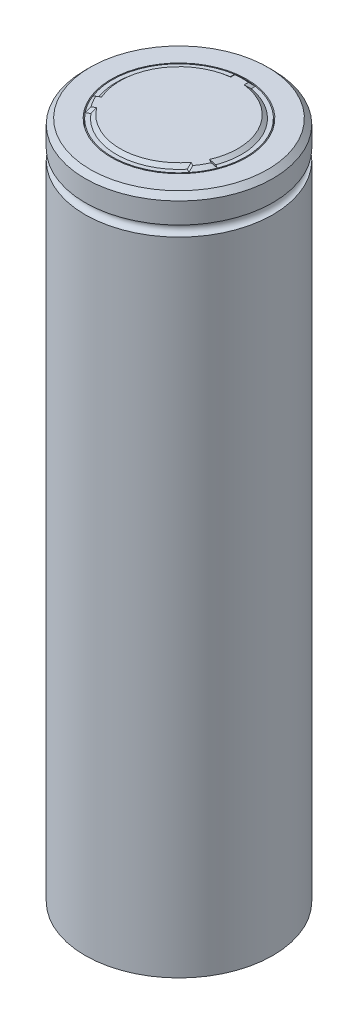
ISO-10303-21;
HEADER;
FILE_DESCRIPTION(('STEP AP214'),'2;1');
FILE_NAME('part.step','',(''),(''),'','','');
FILE_SCHEMA(('AUTOMOTIVE_DESIGN { 1 0 10303 214 1 1 1 1 }'));
ENDSEC;
DATA;
#1=APPLICATION_CONTEXT('core data for automotive mechanical design processes');
#2=APPLICATION_PROTOCOL_DEFINITION('international standard','automotive_design',2000,#1);
#3=PRODUCT_CONTEXT('',#1,'mechanical');
#4=PRODUCT('Part','Part','',(#3));
#5=PRODUCT_RELATED_PRODUCT_CATEGORY('part','',(#4));
#6=PRODUCT_DEFINITION_FORMATION('','',#4);
#7=PRODUCT_DEFINITION_CONTEXT('part definition',#1,'design');
#8=PRODUCT_DEFINITION('design','',#6,#7);
#9=PRODUCT_DEFINITION_SHAPE('','',#8);
#10=(LENGTH_UNIT() NAMED_UNIT(*) SI_UNIT(.MILLI.,.METRE.));
#11=(NAMED_UNIT(*) PLANE_ANGLE_UNIT() SI_UNIT($,.RADIAN.));
#12=(NAMED_UNIT(*) SI_UNIT($,.STERADIAN.) SOLID_ANGLE_UNIT());
#13=UNCERTAINTY_MEASURE_WITH_UNIT(LENGTH_MEASURE(1.E-05),#10,'distance_accuracy_value','');
#14=(GEOMETRIC_REPRESENTATION_CONTEXT(3) GLOBAL_UNCERTAINTY_ASSIGNED_CONTEXT((#13)) GLOBAL_UNIT_ASSIGNED_CONTEXT((#10,
#11,#12)) REPRESENTATION_CONTEXT('',''));
#15=CARTESIAN_POINT('',(0.,0.,0.));
#16=DIRECTION('',(0.,0.,1.));
#17=DIRECTION('',(1.,0.,0.));
#18=AXIS2_PLACEMENT_3D('',#15,#16,#17);
#19=CARTESIAN_POINT('',(0.,65.,0.));
#20=DIRECTION('',(0.,-1.,0.));
#21=DIRECTION('',(0.,0.,-1.));
#22=AXIS2_PLACEMENT_3D('',#19,#20,#21);
#23=CYLINDRICAL_SURFACE('',#22,9.);
#24=CARTESIAN_POINT('',(0.,0.,0.));
#25=DIRECTION('',(0.,1.,0.));
#26=DIRECTION('',(0.,0.,1.));
#27=AXIS2_PLACEMENT_3D('',#24,#25,#26);
#28=CIRCLE('',#27,9.);
#29=CARTESIAN_POINT('',(0.,0.,9.));
#30=VERTEX_POINT('',#29);
#31=EDGE_CURVE('E61',#30,#30,#28,.T.);
#32=ORIENTED_EDGE('',*,*,#31,.T.);
#33=EDGE_LOOP('',(#32));
#34=FACE_BOUND('',#33,.T.);
#35=CARTESIAN_POINT('',(0.,61.5,0.));
#36=DIRECTION('',(0.,1.,0.));
#37=DIRECTION('',(0.,0.,1.));
#38=AXIS2_PLACEMENT_3D('',#35,#36,#37);
#39=CIRCLE('',#38,9.);
#40=CARTESIAN_POINT('',(0.,61.5,9.));
#41=VERTEX_POINT('',#40);
#42=EDGE_CURVE('E67',#41,#41,#39,.T.);
#43=ORIENTED_EDGE('',*,*,#42,.F.);
#44=EDGE_LOOP('',(#43));
#45=FACE_BOUND('',#44,.T.);
#46=ADVANCED_FACE('F46',(#34,#45),#23,.T.);
#47=CARTESIAN_POINT('',(0.,0.,0.));
#48=DIRECTION('',(0.,1.,0.));
#49=DIRECTION('',(0.,0.,1.));
#50=AXIS2_PLACEMENT_3D('',#47,#48,#49);
#51=PLANE('',#50);
#52=CARTESIAN_POINT('',(0.,0.,0.));
#53=DIRECTION('',(0.,-1.,0.));
#54=DIRECTION('',(0.,0.,-1.));
#55=AXIS2_PLACEMENT_3D('',#52,#53,#54);
#56=CIRCLE('',#55,6.5);
#57=CARTESIAN_POINT('',(0.,0.,-6.5));
#58=VERTEX_POINT('',#57);
#59=EDGE_CURVE('E11',#58,#58,#56,.T.);
#60=ORIENTED_EDGE('',*,*,#59,.F.);
#61=EDGE_LOOP('',(#60));
#62=FACE_BOUND('',#61,.T.);
#63=ORIENTED_EDGE('',*,*,#31,.F.);
#64=EDGE_LOOP('',(#63));
#65=FACE_BOUND('',#64,.T.);
#66=ADVANCED_FACE('F48',(#62,#65),#51,.F.);
#67=CARTESIAN_POINT('',(0.,62.,0.));
#68=DIRECTION('',(0.,-1.,0.));
#69=DIRECTION('',(0.,0.,-1.));
#70=AXIS2_PLACEMENT_3D('',#67,#68,#69);
#71=TOROIDAL_SURFACE('',#70,9.,0.500000000000001);
#72=CARTESIAN_POINT('',(0.,62.5,0.));
#73=DIRECTION('',(0.,-1.,0.));
#74=DIRECTION('',(0.,0.,-1.));
#75=AXIS2_PLACEMENT_3D('',#72,#73,#74);
#76=CIRCLE('',#75,9.);
#77=CARTESIAN_POINT('',(0.,62.5,-9.));
#78=VERTEX_POINT('',#77);
#79=EDGE_CURVE('E64',#78,#78,#76,.T.);
#80=ORIENTED_EDGE('',*,*,#79,.T.);
#81=EDGE_LOOP('',(#80));
#82=FACE_BOUND('',#81,.T.);
#83=ORIENTED_EDGE('',*,*,#42,.T.);
#84=EDGE_LOOP('',(#83));
#85=FACE_BOUND('',#84,.T.);
#86=ADVANCED_FACE('F95',(#82,#85),#71,.F.);
#87=CARTESIAN_POINT('',(0.,65.,0.));
#88=DIRECTION('',(0.,1.,0.));
#89=DIRECTION('',(0.,0.,1.));
#90=AXIS2_PLACEMENT_3D('',#87,#88,#89);
#91=PLANE('',#90);
#92=CARTESIAN_POINT('',(0.,65.,0.));
#93=DIRECTION('',(0.,-1.,0.));
#94=DIRECTION('',(0.,0.,-1.));
#95=AXIS2_PLACEMENT_3D('',#92,#93,#94);
#96=CIRCLE('',#95,6.5);
#97=CARTESIAN_POINT('',(0.,65.,-6.5));
#98=VERTEX_POINT('',#97);
#99=EDGE_CURVE('E50',#98,#98,#96,.T.);
#100=ORIENTED_EDGE('',*,*,#99,.T.);
#101=EDGE_LOOP('',(#100));
#102=FACE_BOUND('',#101,.T.);
#103=CARTESIAN_POINT('',(0.,65.,0.));
#104=DIRECTION('',(0.,1.,0.));
#105=DIRECTION('',(0.,0.,1.));
#106=AXIS2_PLACEMENT_3D('',#103,#104,#105);
#107=CIRCLE('',#106,8.5);
#108=CARTESIAN_POINT('',(0.,65.,8.5));
#109=VERTEX_POINT('',#108);
#110=EDGE_CURVE('E58',#109,#109,#107,.T.);
#111=ORIENTED_EDGE('',*,*,#110,.T.);
#112=EDGE_LOOP('',(#111));
#113=FACE_BOUND('',#112,.T.);
#114=ADVANCED_FACE('F76',(#102,#113),#91,.T.);
#115=CARTESIAN_POINT('',(0.,64.5,0.));
#116=DIRECTION('',(0.,1.,0.));
#117=DIRECTION('',(0.,0.,1.));
#118=AXIS2_PLACEMENT_3D('',#115,#116,#117);
#119=CIRCLE('',#118,9.);
#120=CARTESIAN_POINT('',(0.,64.5,9.));
#121=VERTEX_POINT('',#120);
#122=EDGE_CURVE('E54',#121,#121,#119,.F.);
#123=ORIENTED_EDGE('',*,*,#122,.T.);
#124=EDGE_LOOP('',(#123));
#125=FACE_BOUND('',#124,.T.);
#126=ORIENTED_EDGE('',*,*,#79,.F.);
#127=EDGE_LOOP('',(#126));
#128=FACE_BOUND('',#127,.T.);
#129=ADVANCED_FACE('F85',(#125,#128),#23,.T.);
#130=CARTESIAN_POINT('',(0.,65.,0.));
#131=DIRECTION('',(0.,-1.,0.));
#132=DIRECTION('',(0.,0.,-1.));
#133=AXIS2_PLACEMENT_3D('',#130,#131,#132);
#134=CONICAL_SURFACE('',#133,8.5,0.785398163397447);
#135=ORIENTED_EDGE('',*,*,#122,.F.);
#136=EDGE_LOOP('',(#135));
#137=FACE_BOUND('',#136,.T.);
#138=ORIENTED_EDGE('',*,*,#110,.F.);
#139=EDGE_LOOP('',(#138));
#140=FACE_BOUND('',#139,.T.);
#141=ADVANCED_FACE('F80',(#137,#140),#134,.T.);
#142=CARTESIAN_POINT('',(0.,65.,0.));
#143=DIRECTION('',(0.,-1.,0.));
#144=DIRECTION('',(0.,0.,-1.));
#145=AXIS2_PLACEMENT_3D('',#142,#143,#144);
#146=CYLINDRICAL_SURFACE('',#145,6.5);
#147=ORIENTED_EDGE('',*,*,#99,.F.);
#148=EDGE_LOOP('',(#147));
#149=FACE_BOUND('',#148,.T.);
#150=ORIENTED_EDGE('',*,*,#59,.T.);
#151=EDGE_LOOP('',(#150));
#152=FACE_BOUND('',#151,.T.);
#153=ADVANCED_FACE('F78',(#149,#152),#146,.F.);
#154=CLOSED_SHELL('',(#46,#66,#86,#114,#129,#141,#153));
#155=MANIFOLD_SOLID_BREP('B2',#154);
#156=CARTESIAN_POINT('',(0.,65.,0.));
#157=DIRECTION('',(0.,1.,0.));
#158=DIRECTION('',(0.,0.,1.));
#159=AXIS2_PLACEMENT_3D('',#156,#157,#158);
#160=PLANE('',#159);
#161=DIRECTION('',(0.,0.,-1.));
#162=VECTOR('',#161,1.);
#163=CARTESIAN_POINT('',(1.,65.,-5.91607978309962));
#164=LINE('',#163,#162);
#165=CARTESIAN_POINT('',(1.,65.,-5.91607978309962));
#166=VERTEX_POINT('',#165);
#167=CARTESIAN_POINT('',(1.,65.,-6.32139225171164));
#168=VERTEX_POINT('',#167);
#169=EDGE_CURVE('E194',#166,#168,#164,.T.);
#170=ORIENTED_EDGE('',*,*,#169,.F.);
#171=CARTESIAN_POINT('',(0.,65.,0.));
#172=DIRECTION('',(0.,1.,0.));
#173=DIRECTION('',(0.,0.,1.));
#174=AXIS2_PLACEMENT_3D('',#171,#172,#173);
#175=CIRCLE('',#174,6.);
#176=CARTESIAN_POINT('',(5.62347538297981,65.,2.09201448776534));
#177=VERTEX_POINT('',#176);
#178=EDGE_CURVE('E198',#177,#166,#175,.T.);
#179=ORIENTED_EDGE('',*,*,#178,.F.);
#180=DIRECTION('',(-0.866025403784384,0.,-0.500000000000096));
#181=VECTOR('',#180,1.);
#182=CARTESIAN_POINT('',(5.62347538297981,65.,2.09201448776534));
#183=LINE('',#182,#181);
#184=CARTESIAN_POINT('',(5.97448627726839,65.,2.2946707220714));
#185=VERTEX_POINT('',#184);
#186=EDGE_CURVE('E477',#185,#177,#183,.T.);
#187=ORIENTED_EDGE('',*,*,#186,.F.);
#188=CARTESIAN_POINT('',(0.,65.,0.));
#189=DIRECTION('',(0.,-1.,0.));
#190=DIRECTION('',(0.,0.,-1.));
#191=AXIS2_PLACEMENT_3D('',#188,#189,#190);
#192=CIRCLE('',#191,6.4);
#193=EDGE_CURVE('E44',#168,#185,#192,.T.);
#194=ORIENTED_EDGE('',*,*,#193,.F.);
#195=EDGE_LOOP('',(#170,#179,#187,#194));
#196=FACE_BOUND('',#195,.T.);
#197=ADVANCED_FACE('F177',(#196),#160,.T.);
#198=DIRECTION('',(0.866025403784384,0.,0.500000000000096));
#199=VECTOR('',#198,1.);
#200=CARTESIAN_POINT('',(4.62347538297897,65.,3.82406529533525));
#201=LINE('',#200,#199);
#202=CARTESIAN_POINT('',(4.62347538297897,65.,3.82406529533525));
#203=VERTEX_POINT('',#202);
#204=CARTESIAN_POINT('',(4.97448627726755,65.,4.02672152964131));
#205=VERTEX_POINT('',#204);
#206=EDGE_CURVE('E471',#203,#205,#201,.T.);
#207=ORIENTED_EDGE('',*,*,#206,.F.);
#208=CARTESIAN_POINT('',(0.,65.,0.));
#209=DIRECTION('',(0.,1.,0.));
#210=DIRECTION('',(0.,0.,1.));
#211=AXIS2_PLACEMENT_3D('',#208,#209,#210);
#212=CIRCLE('',#211,6.);
#213=CARTESIAN_POINT('',(-4.62347538298061,65.,3.82406529533326));
#214=VERTEX_POINT('',#213);
#215=EDGE_CURVE('E468',#214,#203,#212,.T.);
#216=ORIENTED_EDGE('',*,*,#215,.F.);
#217=DIRECTION('',(0.866025403784489,0.,-0.499999999999912));
#218=VECTOR('',#217,1.);
#219=CARTESIAN_POINT('',(-4.62347538298061,65.,3.82406529533327));
#220=LINE('',#219,#218);
#221=CARTESIAN_POINT('',(-4.97448627726922,65.,4.02672152963924));
#222=VERTEX_POINT('',#221);
#223=EDGE_CURVE('E278',#222,#214,#220,.T.);
#224=ORIENTED_EDGE('',*,*,#223,.F.);
#225=EDGE_CURVE('E186',#205,#222,#192,.T.);
#226=ORIENTED_EDGE('',*,*,#225,.F.);
#227=EDGE_LOOP('',(#207,#216,#224,#226));
#228=FACE_BOUND('',#227,.T.);
#229=ADVANCED_FACE('F442',(#228),#160,.T.);
#230=DIRECTION('',(0.,0.,1.));
#231=VECTOR('',#230,1.);
#232=CARTESIAN_POINT('',(-1.,65.,-5.91607978309962));
#233=LINE('',#232,#231);
#234=CARTESIAN_POINT('',(-1.,65.,-6.32139225171164));
#235=VERTEX_POINT('',#234);
#236=CARTESIAN_POINT('',(-1.,65.,-5.91607978309962));
#237=VERTEX_POINT('',#236);
#238=EDGE_CURVE('E286',#235,#237,#233,.T.);
#239=ORIENTED_EDGE('',*,*,#238,.F.);
#240=CARTESIAN_POINT('',(-5.97448627726842,65.,2.29467072207132));
#241=VERTEX_POINT('',#240);
#242=EDGE_CURVE('E187',#241,#235,#192,.T.);
#243=ORIENTED_EDGE('',*,*,#242,.F.);
#244=DIRECTION('',(-0.866025403784489,0.,0.499999999999913));
#245=VECTOR('',#244,1.);
#246=CARTESIAN_POINT('',(-5.62347538297981,65.,2.09201448776534));
#247=LINE('',#246,#245);
#248=CARTESIAN_POINT('',(-5.62347538297981,65.,2.09201448776534));
#249=VERTEX_POINT('',#248);
#250=EDGE_CURVE('E279',#249,#241,#247,.T.);
#251=ORIENTED_EDGE('',*,*,#250,.F.);
#252=CARTESIAN_POINT('',(0.,65.,0.));
#253=DIRECTION('',(0.,1.,0.));
#254=DIRECTION('',(0.,0.,1.));
#255=AXIS2_PLACEMENT_3D('',#252,#253,#254);
#256=CIRCLE('',#255,6.);
#257=EDGE_CURVE('E295',#237,#249,#256,.T.);
#258=ORIENTED_EDGE('',*,*,#257,.F.);
#259=EDGE_LOOP('',(#239,#243,#251,#258));
#260=FACE_BOUND('',#259,.T.);
#261=ADVANCED_FACE('F283',(#260),#160,.T.);
#262=CARTESIAN_POINT('',(0.,65.,0.));
#263=DIRECTION('',(0.,-1.,0.));
#264=DIRECTION('',(0.,0.,-1.));
#265=AXIS2_PLACEMENT_3D('',#262,#263,#264);
#266=CYLINDRICAL_SURFACE('',#265,6.4);
#267=ORIENTED_EDGE('',*,*,#193,.T.);
#268=CARTESIAN_POINT('',(0.,65.,0.));
#269=DIRECTION('',(0.,1.,0.));
#270=DIRECTION('',(0.,0.,1.));
#271=AXIS2_PLACEMENT_3D('',#268,#269,#270);
#272=CIRCLE('',#271,6.4);
#273=EDGE_CURVE('E474',#205,#185,#272,.T.);
#274=ORIENTED_EDGE('',*,*,#273,.F.);
#275=ORIENTED_EDGE('',*,*,#225,.T.);
#276=CARTESIAN_POINT('',(0.,65.,0.));
#277=DIRECTION('',(0.,1.,0.));
#278=DIRECTION('',(0.,0.,1.));
#279=AXIS2_PLACEMENT_3D('',#276,#277,#278);
#280=CIRCLE('',#279,6.4);
#281=EDGE_CURVE('E268',#241,#222,#280,.T.);
#282=ORIENTED_EDGE('',*,*,#281,.F.);
#283=ORIENTED_EDGE('',*,*,#242,.T.);
#284=CARTESIAN_POINT('',(0.,65.,0.));
#285=DIRECTION('',(0.,1.,0.));
#286=DIRECTION('',(0.,0.,1.));
#287=AXIS2_PLACEMENT_3D('',#284,#285,#286);
#288=CIRCLE('',#287,6.4);
#289=EDGE_CURVE('E480',#168,#235,#288,.T.);
#290=ORIENTED_EDGE('',*,*,#289,.F.);
#291=EDGE_LOOP('',(#267,#274,#275,#282,#283,#290));
#292=FACE_BOUND('',#291,.T.);
#293=CARTESIAN_POINT('',(0.,0.,0.));
#294=DIRECTION('',(0.,-1.,0.));
#295=DIRECTION('',(0.,0.,-1.));
#296=AXIS2_PLACEMENT_3D('',#293,#294,#295);
#297=CIRCLE('',#296,6.4);
#298=CARTESIAN_POINT('',(0.,0.,-6.4));
#299=VERTEX_POINT('',#298);
#300=EDGE_CURVE('E181',#299,#299,#297,.T.);
#301=ORIENTED_EDGE('',*,*,#300,.F.);
#302=EDGE_LOOP('',(#301));
#303=FACE_BOUND('',#302,.T.);
#304=ADVANCED_FACE('F270',(#292,#303),#266,.T.);
#305=CARTESIAN_POINT('',(0.,0.,0.));
#306=DIRECTION('',(0.,1.,0.));
#307=DIRECTION('',(0.,0.,1.));
#308=AXIS2_PLACEMENT_3D('',#305,#306,#307);
#309=PLANE('',#308);
#310=ORIENTED_EDGE('',*,*,#300,.T.);
#311=EDGE_LOOP('',(#310));
#312=FACE_BOUND('',#311,.T.);
#313=ADVANCED_FACE('F179',(#312),#309,.F.);
#314=CARTESIAN_POINT('',(0.,65.,0.));
#315=DIRECTION('',(0.,-1.,0.));
#316=DIRECTION('',(0.,0.,1.));
#317=AXIS2_PLACEMENT_3D('',#314,#315,#316);
#318=CONICAL_SURFACE('',#317,6.,0.872664625997166);
#319=ORIENTED_EDGE('',*,*,#257,.T.);
#320=CARTESIAN_POINT('',(-5.17598251743646,65.3,2.24648991587866));
#321=CARTESIAN_POINT('',(-5.2511552021513,65.250412684668,2.2216528628978));
#322=CARTESIAN_POINT('',(-5.32603266043714,65.2006189971599,2.19636136828614));
#323=CARTESIAN_POINT('',(-5.47519694755351,65.1006189961826,2.14486955676297));
#324=CARTESIAN_POINT('',(-5.54948377778212,65.0504126836907,2.11866924200353));
#325=CARTESIAN_POINT('',(-5.62347538297982,65.,2.09201448776537));
#326=B_SPLINE_CURVE_WITH_KNOTS('',3,(#320,#321,#322,#323,#324,#325),.UNSPECIFIED.,.F.,.F.,(4,2,
4),(0.,0.280234442872825,0.560468222200871),.UNSPECIFIED.);
#327=CARTESIAN_POINT('',(-5.17598251743646,65.3,2.24648991587866));
#328=VERTEX_POINT('',#327);
#329=EDGE_CURVE('E293',#328,#249,#326,.T.);
#330=ORIENTED_EDGE('',*,*,#329,.F.);
#331=CARTESIAN_POINT('',(0.,65.3,0.));
#332=DIRECTION('',(0.,1.,0.));
#333=DIRECTION('',(0.,0.,1.));
#334=AXIS2_PLACEMENT_3D('',#331,#332,#333);
#335=CIRCLE('',#334,5.64247392222174);
#336=CARTESIAN_POINT('',(-0.642473922221742,65.3,-5.60577730758344));
#337=VERTEX_POINT('',#336);
#338=EDGE_CURVE('E317',#337,#328,#335,.T.);
#339=ORIENTED_EDGE('',*,*,#338,.F.);
#340=CARTESIAN_POINT('',(-0.642473922221742,65.3,-5.60577730758344));
#341=CARTESIAN_POINT('',(-0.701569783415724,65.250412684668,-5.65846023572674));
#342=CARTESIAN_POINT('',(-0.760911589392015,65.2006189971599,-5.71066026946726));
#343=CARTESIAN_POINT('',(-0.880086949816133,65.1006189961826,-5.81409442568584));
#344=CARTESIAN_POINT('',(-0.939920503099257,65.0504126836907,-5.86532855045073));
#345=CARTESIAN_POINT('',(-0.999999999999985,65.,-5.91607978309964));
#346=B_SPLINE_CURVE_WITH_KNOTS('',3,(#340,#341,#342,#343,#344,#345),.UNSPECIFIED.,.F.,.F.,(4,2,
4),(0.,0.280234442872816,0.560468222200854),.UNSPECIFIED.);
#347=EDGE_CURVE('E339',#337,#237,#346,.T.);
#348=ORIENTED_EDGE('',*,*,#347,.T.);
#349=EDGE_LOOP('',(#319,#330,#339,#348));
#350=FACE_BOUND('',#349,.T.);
#351=ADVANCED_FACE('F325',(#350),#318,.T.);
#352=CARTESIAN_POINT('',(-5.62347538297981,65.,2.09201448776534));
#353=DIRECTION('',(-0.321393804843213,0.766044443118979,-0.556670399226451));
#354=DIRECTION('',(0.,0.587858883152577,0.808963493303997));
#355=AXIS2_PLACEMENT_3D('',#352,#353,#354);
#356=PLANE('',#355);
#357=ORIENTED_EDGE('',*,*,#250,.T.);
#358=CARTESIAN_POINT('',(-5.52450889038732,65.3,2.44771171112148));
#359=CARTESIAN_POINT('',(-5.60006188679367,65.2503942101823,2.42306880811629));
#360=CARTESIAN_POINT('',(-5.67533653750406,65.20059129027,2.39799392777544));
#361=CARTESIAN_POINT('',(-5.82532899869294,65.1005912894875,2.34698026304409));
#362=CARTESIAN_POINT('',(-5.90004681027625,65.0503942093999,2.32104148036823));
#363=CARTESIAN_POINT('',(-5.97448627726843,65.,2.29467072207133));
#364=B_SPLINE_CURVE_WITH_KNOTS('',3,(#358,#359,#360,#361,#362,#363),.UNSPECIFIED.,.F.,.F.,(4,2,
4),(0.,0.281030570328719,0.562060582915392),.UNSPECIFIED.);
#365=CARTESIAN_POINT('',(-5.52450889038732,65.3,2.44771171112148));
#366=VERTEX_POINT('',#365);
#367=EDGE_CURVE('E290',#366,#241,#364,.T.);
#368=ORIENTED_EDGE('',*,*,#367,.F.);
#369=DIRECTION('',(0.866025403784489,0.,-0.499999999999913));
#370=VECTOR('',#369,1.);
#371=CARTESIAN_POINT('',(-5.44471234409071,65.3,2.40164115363674));
#372=LINE('',#371,#370);
#373=EDGE_CURVE('E485',#328,#366,#372,.F.);
#374=ORIENTED_EDGE('',*,*,#373,.F.);
#375=ORIENTED_EDGE('',*,*,#329,.T.);
#376=EDGE_LOOP('',(#357,#368,#374,#375));
#377=FACE_BOUND('',#376,.T.);
#378=ADVANCED_FACE('F289',(#377),#356,.T.);
#379=CARTESIAN_POINT('',(0.,65.,0.));
#380=DIRECTION('',(0.,-1.,0.));
#381=DIRECTION('',(0.,0.,1.));
#382=AXIS2_PLACEMENT_3D('',#379,#380,#381);
#383=CONICAL_SURFACE('',#382,6.4,0.872664625997166);
#384=ORIENTED_EDGE('',*,*,#281,.T.);
#385=CARTESIAN_POINT('',(-4.88203496816631,65.3,3.5605091869466));
#386=CARTESIAN_POINT('',(-4.89847008634401,65.2503942101823,3.63826145266912));
#387=CARTESIAN_POINT('',(-4.91439192832719,65.20059129027,3.71598865261575));
#388=CARTESIAN_POINT('',(-4.94520902932417,65.1005912894875,3.87139276674713));
#389=CARTESIAN_POINT('',(-4.96010429037531,65.0503942093999,3.94906968103139));
#390=CARTESIAN_POINT('',(-4.97448627726924,65.,4.02672152963924));
#391=B_SPLINE_CURVE_WITH_KNOTS('',3,(#385,#386,#387,#388,#389,#390),.UNSPECIFIED.,.F.,.F.,(4,2,
4),(0.,0.281030570328721,0.562060582915395),.UNSPECIFIED.);
#392=CARTESIAN_POINT('',(-4.88203496816631,65.3,3.5605091869466));
#393=VERTEX_POINT('',#392);
#394=EDGE_CURVE('E299',#393,#222,#391,.T.);
#395=ORIENTED_EDGE('',*,*,#394,.F.);
#396=CARTESIAN_POINT('',(0.,65.3,0.));
#397=DIRECTION('',(0.,1.,0.));
#398=DIRECTION('',(0.,0.,1.));
#399=AXIS2_PLACEMENT_3D('',#396,#397,#398);
#400=CIRCLE('',#399,6.04247392222174);
#401=EDGE_CURVE('E298',#366,#393,#400,.T.);
#402=ORIENTED_EDGE('',*,*,#401,.F.);
#403=ORIENTED_EDGE('',*,*,#367,.T.);
#404=EDGE_LOOP('',(#384,#395,#402,#403));
#405=FACE_BOUND('',#404,.T.);
#406=ADVANCED_FACE('F297',(#405),#383,.T.);
#407=CARTESIAN_POINT('',(-4.62347538298061,65.,3.82406529533327));
#408=DIRECTION('',(0.321393804843213,0.766044443118979,0.556670399226451));
#409=DIRECTION('',(0.,-0.587858883152577,0.808963493303996));
#410=AXIS2_PLACEMENT_3D('',#407,#408,#409);
#411=PLANE('',#410);
#412=ORIENTED_EDGE('',*,*,#223,.T.);
#413=CARTESIAN_POINT('',(-4.53350859521545,65.3,3.35928739170379));
#414=CARTESIAN_POINT('',(-4.54958541873632,65.250412684668,3.43680737282794));
#415=CARTESIAN_POINT('',(-4.56512107104588,65.2006189971599,3.51429890118012));
#416=CARTESIAN_POINT('',(-4.59510999773816,65.1006189961826,3.66922486892187));
#417=CARTESIAN_POINT('',(-4.60956327468366,65.0504126836907,3.74665930844619));
#418=CARTESIAN_POINT('',(-4.62347538298064,65.,3.82406529533327));
#419=B_SPLINE_CURVE_WITH_KNOTS('',3,(#413,#414,#415,#416,#417,#418),.UNSPECIFIED.,.F.,.F.,(4,2,
4),(0.,0.280234442872826,0.560468222200874),.UNSPECIFIED.);
#420=CARTESIAN_POINT('',(-4.53350859521545,65.3,3.35928739170379));
#421=VERTEX_POINT('',#420);
#422=EDGE_CURVE('E302',#421,#214,#419,.T.);
#423=ORIENTED_EDGE('',*,*,#422,.F.);
#424=DIRECTION('',(-0.866025403784489,0.,0.499999999999912));
#425=VECTOR('',#424,1.);
#426=CARTESIAN_POINT('',(-4.80223842186971,65.3,3.51443862946187));
#427=LINE('',#426,#425);
#428=EDGE_CURVE('E487',#393,#421,#427,.F.);
#429=ORIENTED_EDGE('',*,*,#428,.F.);
#430=ORIENTED_EDGE('',*,*,#394,.T.);
#431=EDGE_LOOP('',(#412,#423,#429,#430));
#432=FACE_BOUND('',#431,.T.);
#433=ADVANCED_FACE('F430',(#432),#411,.T.);
#434=CARTESIAN_POINT('',(0.,65.,0.));
#435=DIRECTION('',(0.,-1.,0.));
#436=DIRECTION('',(0.,0.,1.));
#437=AXIS2_PLACEMENT_3D('',#434,#435,#436);
#438=CONICAL_SURFACE('',#437,6.,0.872664625997166);
#439=ORIENTED_EDGE('',*,*,#215,.T.);
#440=CARTESIAN_POINT('',(4.53350859521397,65.3,3.35928739170579));
#441=CARTESIAN_POINT('',(4.54958541873481,65.250412684668,3.43680737282994));
#442=CARTESIAN_POINT('',(4.56512107104435,65.2006189971599,3.51429890118212));
#443=CARTESIAN_POINT('',(4.59510999773657,65.1006189961826,3.66922486892386));
#444=CARTESIAN_POINT('',(4.60956327468204,65.0504126836907,3.74665930844818));
#445=CARTESIAN_POINT('',(4.623475382979,65.,3.82406529533525));
#446=B_SPLINE_CURVE_WITH_KNOTS('',3,(#440,#441,#442,#443,#444,#445),.UNSPECIFIED.,.F.,.F.,(4,2,
4),(0.,0.280234442872807,0.560468222200834),.UNSPECIFIED.);
#447=CARTESIAN_POINT('',(4.53350859521397,65.3,3.35928739170579));
#448=VERTEX_POINT('',#447);
#449=EDGE_CURVE('E417',#448,#203,#446,.T.);
#450=ORIENTED_EDGE('',*,*,#449,.F.);
#451=CARTESIAN_POINT('',(0.,65.3,0.));
#452=DIRECTION('',(0.,1.,0.));
#453=DIRECTION('',(0.,0.,1.));
#454=AXIS2_PLACEMENT_3D('',#451,#452,#453);
#455=CIRCLE('',#454,5.64247392222174);
#456=EDGE_CURVE('E491',#421,#448,#455,.T.);
#457=ORIENTED_EDGE('',*,*,#456,.F.);
#458=ORIENTED_EDGE('',*,*,#422,.T.);
#459=EDGE_LOOP('',(#439,#450,#457,#458));
#460=FACE_BOUND('',#459,.T.);
#461=ADVANCED_FACE('F427',(#460),#438,.T.);
#462=CARTESIAN_POINT('',(4.62347538297897,65.,3.82406529533525));
#463=DIRECTION('',(-0.321393804843331,0.766044443118979,0.556670399226383));
#464=DIRECTION('',(0.,-0.58785888315253,0.808963493304031));
#465=AXIS2_PLACEMENT_3D('',#462,#463,#464);
#466=PLANE('',#465);
#467=ORIENTED_EDGE('',*,*,#206,.T.);
#468=CARTESIAN_POINT('',(4.8820349681648,65.3,3.56050918694868));
#469=CARTESIAN_POINT('',(4.89847008634247,65.2503942101823,3.6382614526712));
#470=CARTESIAN_POINT('',(4.91439192832562,65.20059129027,3.71598865261782));
#471=CARTESIAN_POINT('',(4.94520902932255,65.1005912894875,3.87139276674921));
#472=CARTESIAN_POINT('',(4.96010429037366,65.0503942093999,3.94906968103346));
#473=CARTESIAN_POINT('',(4.97448627726757,65.,4.02672152964131));
#474=B_SPLINE_CURVE_WITH_KNOTS('',3,(#468,#469,#470,#471,#472,#473),.UNSPECIFIED.,.F.,.F.,(4,2,
4),(0.,0.281030570328702,0.562060582915358),.UNSPECIFIED.);
#475=CARTESIAN_POINT('',(4.8820349681648,65.3,3.56050918694868));
#476=VERTEX_POINT('',#475);
#477=EDGE_CURVE('E410',#476,#205,#474,.T.);
#478=ORIENTED_EDGE('',*,*,#477,.F.);
#479=DIRECTION('',(-0.866025403784384,0.,-0.500000000000096));
#480=VECTOR('',#479,1.);
#481=CARTESIAN_POINT('',(4.80223842186813,65.3,3.51443862946389));
#482=LINE('',#481,#480);
#483=EDGE_CURVE('E493',#448,#476,#482,.F.);
#484=ORIENTED_EDGE('',*,*,#483,.F.);
#485=ORIENTED_EDGE('',*,*,#449,.T.);
#486=EDGE_LOOP('',(#467,#478,#484,#485));
#487=FACE_BOUND('',#486,.T.);
#488=ADVANCED_FACE('F405',(#487),#466,.T.);
#489=CARTESIAN_POINT('',(0.,65.,0.));
#490=DIRECTION('',(0.,-1.,0.));
#491=DIRECTION('',(0.,0.,1.));
#492=AXIS2_PLACEMENT_3D('',#489,#490,#491);
#493=CONICAL_SURFACE('',#492,6.4,0.872664625997166);
#494=ORIENTED_EDGE('',*,*,#273,.T.);
#495=CARTESIAN_POINT('',(5.52450889038732,65.3,2.4477117111215));
#496=CARTESIAN_POINT('',(5.60006188679366,65.2503942101823,2.42306880811632));
#497=CARTESIAN_POINT('',(5.67533653750405,65.20059129027,2.39799392777548));
#498=CARTESIAN_POINT('',(5.82532899869291,65.1005912894875,2.34698026304415));
#499=CARTESIAN_POINT('',(5.90004681027622,65.0503942093999,2.3210414803683));
#500=CARTESIAN_POINT('',(5.9744862772684,65.,2.29467072207141));
#501=B_SPLINE_CURVE_WITH_KNOTS('',3,(#495,#496,#497,#498,#499,#500),.UNSPECIFIED.,.F.,.F.,(4,2,
4),(0.,0.281030570328701,0.562060582915356),.UNSPECIFIED.);
#502=CARTESIAN_POINT('',(5.52450889038732,65.3,2.4477117111215));
#503=VERTEX_POINT('',#502);
#504=EDGE_CURVE('E389',#503,#185,#501,.T.);
#505=ORIENTED_EDGE('',*,*,#504,.F.);
#506=CARTESIAN_POINT('',(0.,65.3,0.));
#507=DIRECTION('',(0.,1.,0.));
#508=DIRECTION('',(0.,0.,1.));
#509=AXIS2_PLACEMENT_3D('',#506,#507,#508);
#510=CIRCLE('',#509,6.04247392222174);
#511=EDGE_CURVE('E495',#476,#503,#510,.T.);
#512=ORIENTED_EDGE('',*,*,#511,.F.);
#513=ORIENTED_EDGE('',*,*,#477,.T.);
#514=EDGE_LOOP('',(#494,#505,#512,#513));
#515=FACE_BOUND('',#514,.T.);
#516=ADVANCED_FACE('F399',(#515),#493,.T.);
#517=CARTESIAN_POINT('',(5.62347538297981,65.,2.09201448776534));
#518=DIRECTION('',(0.321393804843331,0.766044443118979,-0.556670399226383));
#519=DIRECTION('',(0.,0.58785888315253,0.808963493304031));
#520=AXIS2_PLACEMENT_3D('',#517,#518,#519);
#521=PLANE('',#520);
#522=ORIENTED_EDGE('',*,*,#186,.T.);
#523=CARTESIAN_POINT('',(5.17598251743649,65.3,2.2464899158786));
#524=CARTESIAN_POINT('',(5.25115520215132,65.250412684668,2.22165286289775));
#525=CARTESIAN_POINT('',(5.32603266043716,65.2006189971599,2.1963613682861));
#526=CARTESIAN_POINT('',(5.47519694755352,65.1006189961826,2.14486955676295));
#527=CARTESIAN_POINT('',(5.54948377778213,65.0504126836907,2.11866924200352));
#528=CARTESIAN_POINT('',(5.62347538297982,65.,2.09201448776537));
#529=B_SPLINE_CURVE_WITH_KNOTS('',3,(#523,#524,#525,#526,#527,#528),.UNSPECIFIED.,.F.,.F.,(4,2,
4),(0.,0.280234442872806,0.560468222200834),.UNSPECIFIED.);
#530=CARTESIAN_POINT('',(5.17598251743649,65.3,2.2464899158786));
#531=VERTEX_POINT('',#530);
#532=EDGE_CURVE('E382',#531,#177,#529,.T.);
#533=ORIENTED_EDGE('',*,*,#532,.F.);
#534=DIRECTION('',(0.866025403784384,0.,0.500000000000096));
#535=VECTOR('',#534,1.);
#536=CARTESIAN_POINT('',(5.44471234409065,65.3,2.4016411536367));
#537=LINE('',#536,#535);
#538=EDGE_CURVE('E497',#503,#531,#537,.F.);
#539=ORIENTED_EDGE('',*,*,#538,.F.);
#540=ORIENTED_EDGE('',*,*,#504,.T.);
#541=EDGE_LOOP('',(#522,#533,#539,#540));
#542=FACE_BOUND('',#541,.T.);
#543=ADVANCED_FACE('F396',(#542),#521,.T.);
#544=CARTESIAN_POINT('',(0.,65.,0.));
#545=DIRECTION('',(0.,-1.,0.));
#546=DIRECTION('',(0.,0.,1.));
#547=AXIS2_PLACEMENT_3D('',#544,#545,#546);
#548=CONICAL_SURFACE('',#547,6.,0.872664625997166);
#549=ORIENTED_EDGE('',*,*,#178,.T.);
#550=CARTESIAN_POINT('',(0.642473922221742,65.3,-5.60577730758344));
#551=CARTESIAN_POINT('',(0.701569783415724,65.250412684668,-5.65846023572674));
#552=CARTESIAN_POINT('',(0.760911589392015,65.2006189971599,-5.71066026946726));
#553=CARTESIAN_POINT('',(0.880086949816133,65.1006189961826,-5.81409442568584));
#554=CARTESIAN_POINT('',(0.939920503099257,65.0504126836907,-5.86532855045073));
#555=CARTESIAN_POINT('',(0.999999999999985,65.,-5.91607978309964));
#556=B_SPLINE_CURVE_WITH_KNOTS('',3,(#550,#551,#552,#553,#554,#555),.UNSPECIFIED.,.F.,.F.,(4,2,
4),(0.,0.280234442872816,0.560468222200854),.UNSPECIFIED.);
#557=CARTESIAN_POINT('',(0.642473922221742,65.3,-5.60577730758344));
#558=VERTEX_POINT('',#557);
#559=EDGE_CURVE('E375',#558,#166,#556,.T.);
#560=ORIENTED_EDGE('',*,*,#559,.F.);
#561=CARTESIAN_POINT('',(0.,65.3,0.));
#562=DIRECTION('',(0.,1.,0.));
#563=DIRECTION('',(0.,0.,1.));
#564=AXIS2_PLACEMENT_3D('',#561,#562,#563);
#565=CIRCLE('',#564,5.64247392222174);
#566=EDGE_CURVE('E499',#531,#558,#565,.T.);
#567=ORIENTED_EDGE('',*,*,#566,.F.);
#568=ORIENTED_EDGE('',*,*,#532,.T.);
#569=EDGE_LOOP('',(#549,#560,#567,#568));
#570=FACE_BOUND('',#569,.T.);
#571=ADVANCED_FACE('F370',(#570),#548,.T.);
#572=CARTESIAN_POINT('',(1.,65.,-5.91607978309962));
#573=DIRECTION('',(0.642787609686539,0.766044443118979,0.));
#574=DIRECTION('',(-0.766044443118979,0.642787609686539,0.));
#575=AXIS2_PLACEMENT_3D('',#572,#573,#574);
#576=PLANE('',#575);
#577=ORIENTED_EDGE('',*,*,#169,.T.);
#578=CARTESIAN_POINT('',(0.642473922221743,65.3,-6.00822089806915));
#579=CARTESIAN_POINT('',(0.701591800450397,65.2503942101823,-6.06133026078648));
#580=CARTESIAN_POINT('',(0.760944609177626,65.20059129027,-6.11398258039226));
#581=CARTESIAN_POINT('',(0.880119969369542,65.1005912894875,-6.2183730297923));
#582=CARTESIAN_POINT('',(0.93994251990173,65.0503942093999,-6.2701111614007));
#583=CARTESIAN_POINT('',(0.999999999999991,65.,-6.32139225171166));
#584=B_SPLINE_CURVE_WITH_KNOTS('',3,(#578,#579,#580,#581,#582,#583),.UNSPECIFIED.,.F.,.F.,(4,2,
4),(0.,0.281030570328711,0.562060582915376),.UNSPECIFIED.);
#585=CARTESIAN_POINT('',(0.642473922221743,65.3,-6.00822089806915));
#586=VERTEX_POINT('',#585);
#587=EDGE_CURVE('E354',#586,#168,#584,.T.);
#588=ORIENTED_EDGE('',*,*,#587,.F.);
#589=DIRECTION('',(0.,0.,1.));
#590=VECTOR('',#589,1.);
#591=CARTESIAN_POINT('',(0.642473922221743,65.3,-5.91607978309962));
#592=LINE('',#591,#590);
#593=EDGE_CURVE('E501',#558,#586,#592,.F.);
#594=ORIENTED_EDGE('',*,*,#593,.F.);
#595=ORIENTED_EDGE('',*,*,#559,.T.);
#596=EDGE_LOOP('',(#577,#588,#594,#595));
#597=FACE_BOUND('',#596,.T.);
#598=ADVANCED_FACE('F364',(#597),#576,.T.);
#599=CARTESIAN_POINT('',(0.,65.,0.));
#600=DIRECTION('',(0.,-1.,0.));
#601=DIRECTION('',(0.,0.,1.));
#602=AXIS2_PLACEMENT_3D('',#599,#600,#601);
#603=CONICAL_SURFACE('',#602,6.4,0.872664625997166);
#604=ORIENTED_EDGE('',*,*,#289,.T.);
#605=CARTESIAN_POINT('',(-0.642473922221743,65.3,-6.00822089806915));
#606=CARTESIAN_POINT('',(-0.701591800450397,65.2503942101823,-6.06133026078648));
#607=CARTESIAN_POINT('',(-0.760944609177626,65.20059129027,-6.11398258039226));
#608=CARTESIAN_POINT('',(-0.880119969369542,65.1005912894875,-6.2183730297923));
#609=CARTESIAN_POINT('',(-0.93994251990173,65.0503942093999,-6.2701111614007));
#610=CARTESIAN_POINT('',(-0.999999999999991,65.,-6.32139225171166));
#611=B_SPLINE_CURVE_WITH_KNOTS('',3,(#605,#606,#607,#608,#609,#610),.UNSPECIFIED.,.F.,.F.,(4,2,
4),(0.,0.281030570328711,0.562060582915376),.UNSPECIFIED.);
#612=CARTESIAN_POINT('',(-0.642473922221743,65.3,-6.00822089806915));
#613=VERTEX_POINT('',#612);
#614=EDGE_CURVE('E346',#613,#235,#611,.T.);
#615=ORIENTED_EDGE('',*,*,#614,.F.);
#616=CARTESIAN_POINT('',(0.,65.3,0.));
#617=DIRECTION('',(0.,1.,0.));
#618=DIRECTION('',(0.,0.,1.));
#619=AXIS2_PLACEMENT_3D('',#616,#617,#618);
#620=CIRCLE('',#619,6.04247392222174);
#621=EDGE_CURVE('E503',#586,#613,#620,.T.);
#622=ORIENTED_EDGE('',*,*,#621,.F.);
#623=ORIENTED_EDGE('',*,*,#587,.T.);
#624=EDGE_LOOP('',(#604,#615,#622,#623));
#625=FACE_BOUND('',#624,.T.);
#626=ADVANCED_FACE('F361',(#625),#603,.T.);
#627=CARTESIAN_POINT('',(-1.,65.,-5.91607978309962));
#628=DIRECTION('',(-0.642787609686539,0.766044443118979,0.));
#629=DIRECTION('',(-0.766044443118979,-0.642787609686539,0.));
#630=AXIS2_PLACEMENT_3D('',#627,#628,#629);
#631=PLANE('',#630);
#632=ORIENTED_EDGE('',*,*,#238,.T.);
#633=ORIENTED_EDGE('',*,*,#347,.F.);
#634=DIRECTION('',(0.,0.,-1.));
#635=VECTOR('',#634,1.);
#636=CARTESIAN_POINT('',(-0.642473922221743,65.3,-5.91607978309962));
#637=LINE('',#636,#635);
#638=EDGE_CURVE('E347',#613,#337,#637,.F.);
#639=ORIENTED_EDGE('',*,*,#638,.F.);
#640=ORIENTED_EDGE('',*,*,#614,.T.);
#641=EDGE_LOOP('',(#632,#633,#639,#640));
#642=FACE_BOUND('',#641,.T.);
#643=ADVANCED_FACE('F328',(#642),#631,.T.);
#644=CARTESIAN_POINT('',(0.,65.3,0.));
#645=DIRECTION('',(0.,1.,0.));
#646=DIRECTION('',(0.,0.,1.));
#647=AXIS2_PLACEMENT_3D('',#644,#645,#646);
#648=PLANE('',#647);
#649=ORIENTED_EDGE('',*,*,#338,.T.);
#650=ORIENTED_EDGE('',*,*,#373,.T.);
#651=ORIENTED_EDGE('',*,*,#401,.T.);
#652=ORIENTED_EDGE('',*,*,#428,.T.);
#653=ORIENTED_EDGE('',*,*,#456,.T.);
#654=ORIENTED_EDGE('',*,*,#483,.T.);
#655=ORIENTED_EDGE('',*,*,#511,.T.);
#656=ORIENTED_EDGE('',*,*,#538,.T.);
#657=ORIENTED_EDGE('',*,*,#566,.T.);
#658=ORIENTED_EDGE('',*,*,#593,.T.);
#659=ORIENTED_EDGE('',*,*,#621,.T.);
#660=ORIENTED_EDGE('',*,*,#638,.T.);
#661=EDGE_LOOP('',(#649,#650,#651,#652,#653,#654,#655,#656,#657,#658,#659,#660));
#662=FACE_BOUND('',#661,.T.);
#663=ADVANCED_FACE('F506',(#662),#648,.T.);
#664=CLOSED_SHELL('',(#197,#229,#261,#304,#313,#351,#378,#406,#433,#461,#488,#516,#543,#571,
#598,#626,#643,#663));
#665=MANIFOLD_SOLID_BREP('B6',#664);
#666=ADVANCED_BREP_SHAPE_REPRESENTATION('',(#18,#155,#665),#14);
#667=SHAPE_DEFINITION_REPRESENTATION(#9,#666);
ENDSEC;
END-ISO-10303-21;
